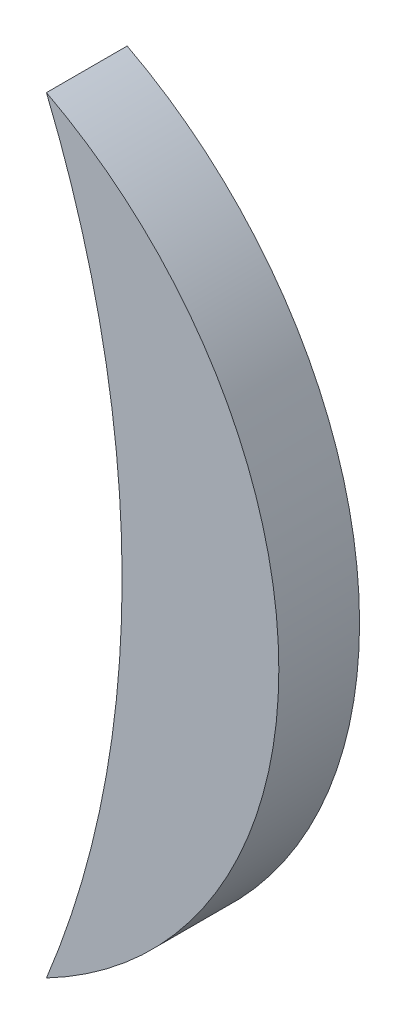
ISO-10303-21;
HEADER;
FILE_DESCRIPTION(('STEP AP214'),'2;1');
FILE_NAME('part.step','',(''),(''),'','','');
FILE_SCHEMA(('AUTOMOTIVE_DESIGN { 1 0 10303 214 1 1 1 1 }'));
ENDSEC;
DATA;
#1=APPLICATION_CONTEXT('core data for automotive mechanical design processes');
#2=APPLICATION_PROTOCOL_DEFINITION('international standard','automotive_design',2000,#1);
#3=PRODUCT_CONTEXT('',#1,'mechanical');
#4=PRODUCT('Part','Part','',(#3));
#5=PRODUCT_RELATED_PRODUCT_CATEGORY('part','',(#4));
#6=PRODUCT_DEFINITION_FORMATION('','',#4);
#7=PRODUCT_DEFINITION_CONTEXT('part definition',#1,'design');
#8=PRODUCT_DEFINITION('design','',#6,#7);
#9=PRODUCT_DEFINITION_SHAPE('','',#8);
#10=(LENGTH_UNIT() NAMED_UNIT(*) SI_UNIT(.MILLI.,.METRE.));
#11=(NAMED_UNIT(*) PLANE_ANGLE_UNIT() SI_UNIT($,.RADIAN.));
#12=(NAMED_UNIT(*) SI_UNIT($,.STERADIAN.) SOLID_ANGLE_UNIT());
#13=UNCERTAINTY_MEASURE_WITH_UNIT(LENGTH_MEASURE(1.E-05),#10,'distance_accuracy_value','');
#14=(GEOMETRIC_REPRESENTATION_CONTEXT(3) GLOBAL_UNCERTAINTY_ASSIGNED_CONTEXT((#13)) GLOBAL_UNIT_ASSIGNED_CONTEXT((#10,
#11,#12)) REPRESENTATION_CONTEXT('',''));
#15=CARTESIAN_POINT('',(0.,0.,0.));
#16=DIRECTION('',(0.,0.,1.));
#17=DIRECTION('',(1.,0.,0.));
#18=AXIS2_PLACEMENT_3D('',#15,#16,#17);
#19=CARTESIAN_POINT('',(5.588,13.208,0.));
#20=DIRECTION('',(0.,0.,-1.));
#21=DIRECTION('',(1.,0.,0.));
#22=AXIS2_PLACEMENT_3D('',#19,#20,#21);
#23=CYLINDRICAL_SURFACE('',#22,0.4445);
#24=DIRECTION('',(0.,0.,1.));
#25=VECTOR('',#24,1.);
#26=CARTESIAN_POINT('',(5.9991640778612,13.0391084635735,0.));
#27=LINE('',#26,#25);
#28=CARTESIAN_POINT('',(5.9991640778612,13.0391084635735,0.));
#29=VERTEX_POINT('',#28);
#30=CARTESIAN_POINT('',(5.9991640778612,13.0391084635735,0.03556));
#31=VERTEX_POINT('',#30);
#32=EDGE_CURVE('E11',#29,#31,#27,.T.);
#33=ORIENTED_EDGE('',*,*,#32,.T.);
#34=CARTESIAN_POINT('',(5.588,13.208,0.03556));
#35=DIRECTION('',(0.,0.,1.));
#36=DIRECTION('',(1.,0.,0.));
#37=AXIS2_PLACEMENT_3D('',#34,#35,#36);
#38=CIRCLE('',#37,0.4445);
#39=CARTESIAN_POINT('',(6.0325,13.208,0.03556));
#40=VERTEX_POINT('',#39);
#41=EDGE_CURVE('E23',#31,#40,#38,.T.);
#42=ORIENTED_EDGE('',*,*,#41,.T.);
#43=DIRECTION('',(0.,0.,1.));
#44=VECTOR('',#43,1.);
#45=CARTESIAN_POINT('',(6.0325,13.208,0.));
#46=LINE('',#45,#44);
#47=CARTESIAN_POINT('',(6.0325,13.208,0.));
#48=VERTEX_POINT('',#47);
#49=EDGE_CURVE('E69',#48,#40,#46,.T.);
#50=ORIENTED_EDGE('',*,*,#49,.F.);
#51=CARTESIAN_POINT('',(5.588,13.208,0.));
#52=DIRECTION('',(0.,0.,1.));
#53=DIRECTION('',(1.,0.,0.));
#54=AXIS2_PLACEMENT_3D('',#51,#52,#53);
#55=CIRCLE('',#54,0.4445);
#56=EDGE_CURVE('E61',#29,#48,#55,.T.);
#57=ORIENTED_EDGE('',*,*,#56,.F.);
#58=EDGE_LOOP('',(#33,#42,#50,#57));
#59=FACE_BOUND('',#58,.T.);
#60=ADVANCED_FACE('F16',(#59),#23,.F.);
#61=CARTESIAN_POINT('',(5.588,13.208,0.));
#62=DIRECTION('',(0.,0.,-1.));
#63=DIRECTION('',(1.,0.,0.));
#64=AXIS2_PLACEMENT_3D('',#61,#62,#63);
#65=CYLINDRICAL_SURFACE('',#64,0.4445);
#66=ORIENTED_EDGE('',*,*,#49,.T.);
#67=CARTESIAN_POINT('',(5.588,13.208,0.03556));
#68=DIRECTION('',(0.,0.,1.));
#69=DIRECTION('',(1.,0.,0.));
#70=AXIS2_PLACEMENT_3D('',#67,#68,#69);
#71=CIRCLE('',#70,0.4445);
#72=CARTESIAN_POINT('',(5.9991640778612,13.3768915364265,0.03556));
#73=VERTEX_POINT('',#72);
#74=EDGE_CURVE('E53',#40,#73,#71,.T.);
#75=ORIENTED_EDGE('',*,*,#74,.T.);
#76=DIRECTION('',(0.,0.,1.));
#77=VECTOR('',#76,1.);
#78=CARTESIAN_POINT('',(5.9991640778612,13.3768915364265,0.));
#79=LINE('',#78,#77);
#80=CARTESIAN_POINT('',(5.9991640778612,13.3768915364265,0.));
#81=VERTEX_POINT('',#80);
#82=EDGE_CURVE('E48',#81,#73,#79,.T.);
#83=ORIENTED_EDGE('',*,*,#82,.F.);
#84=EDGE_CURVE('E51',#48,#81,#55,.T.);
#85=ORIENTED_EDGE('',*,*,#84,.F.);
#86=EDGE_LOOP('',(#66,#75,#83,#85));
#87=FACE_BOUND('',#86,.T.);
#88=ADVANCED_FACE('F50',(#87),#65,.F.);
#89=CARTESIAN_POINT('',(5.91103974,13.208,0.));
#90=DIRECTION('',(0.,0.,-1.));
#91=DIRECTION('',(0.,-1.,0.));
#92=AXIS2_PLACEMENT_3D('',#89,#90,#91);
#93=CYLINDRICAL_SURFACE('',#92,0.1905);
#94=CARTESIAN_POINT('',(5.91103974,13.208,0.03556));
#95=DIRECTION('',(0.,0.,1.));
#96=DIRECTION('',(0.,-1.,0.));
#97=AXIS2_PLACEMENT_3D('',#94,#95,#96);
#98=CIRCLE('',#97,0.1905);
#99=EDGE_CURVE('E62',#31,#73,#98,.T.);
#100=ORIENTED_EDGE('',*,*,#99,.F.);
#101=ORIENTED_EDGE('',*,*,#32,.F.);
#102=CARTESIAN_POINT('',(5.91103974,13.208,0.));
#103=DIRECTION('',(0.,0.,1.));
#104=DIRECTION('',(0.,-1.,0.));
#105=AXIS2_PLACEMENT_3D('',#102,#103,#104);
#106=CIRCLE('',#105,0.1905);
#107=EDGE_CURVE('E60',#29,#81,#106,.T.);
#108=ORIENTED_EDGE('',*,*,#107,.T.);
#109=ORIENTED_EDGE('',*,*,#82,.T.);
#110=EDGE_LOOP('',(#100,#101,#108,#109));
#111=FACE_BOUND('',#110,.T.);
#112=ADVANCED_FACE('F64',(#111),#93,.T.);
#113=CARTESIAN_POINT('',(5.74951987,13.208,0.));
#114=DIRECTION('',(0.,0.,1.));
#115=DIRECTION('',(1.,0.,0.));
#116=AXIS2_PLACEMENT_3D('',#113,#114,#115);
#117=PLANE('',#116);
#118=ORIENTED_EDGE('',*,*,#107,.F.);
#119=ORIENTED_EDGE('',*,*,#56,.T.);
#120=ORIENTED_EDGE('',*,*,#84,.T.);
#121=EDGE_LOOP('',(#118,#119,#120));
#122=FACE_BOUND('',#121,.T.);
#123=ADVANCED_FACE('F59',(#122),#117,.F.);
#124=CARTESIAN_POINT('',(5.74951987,13.208,0.03556));
#125=DIRECTION('',(0.,0.,1.));
#126=DIRECTION('',(1.,0.,0.));
#127=AXIS2_PLACEMENT_3D('',#124,#125,#126);
#128=PLANE('',#127);
#129=ORIENTED_EDGE('',*,*,#41,.F.);
#130=ORIENTED_EDGE('',*,*,#99,.T.);
#131=ORIENTED_EDGE('',*,*,#74,.F.);
#132=EDGE_LOOP('',(#129,#130,#131));
#133=FACE_BOUND('',#132,.T.);
#134=ADVANCED_FACE('F71',(#133),#128,.T.);
#135=CLOSED_SHELL('',(#60,#88,#112,#123,#134));
#136=MANIFOLD_SOLID_BREP('B1',#135);
#137=ADVANCED_BREP_SHAPE_REPRESENTATION('',(#18,#136),#14);
#138=SHAPE_DEFINITION_REPRESENTATION(#9,#137);
ENDSEC;
END-ISO-10303-21;
